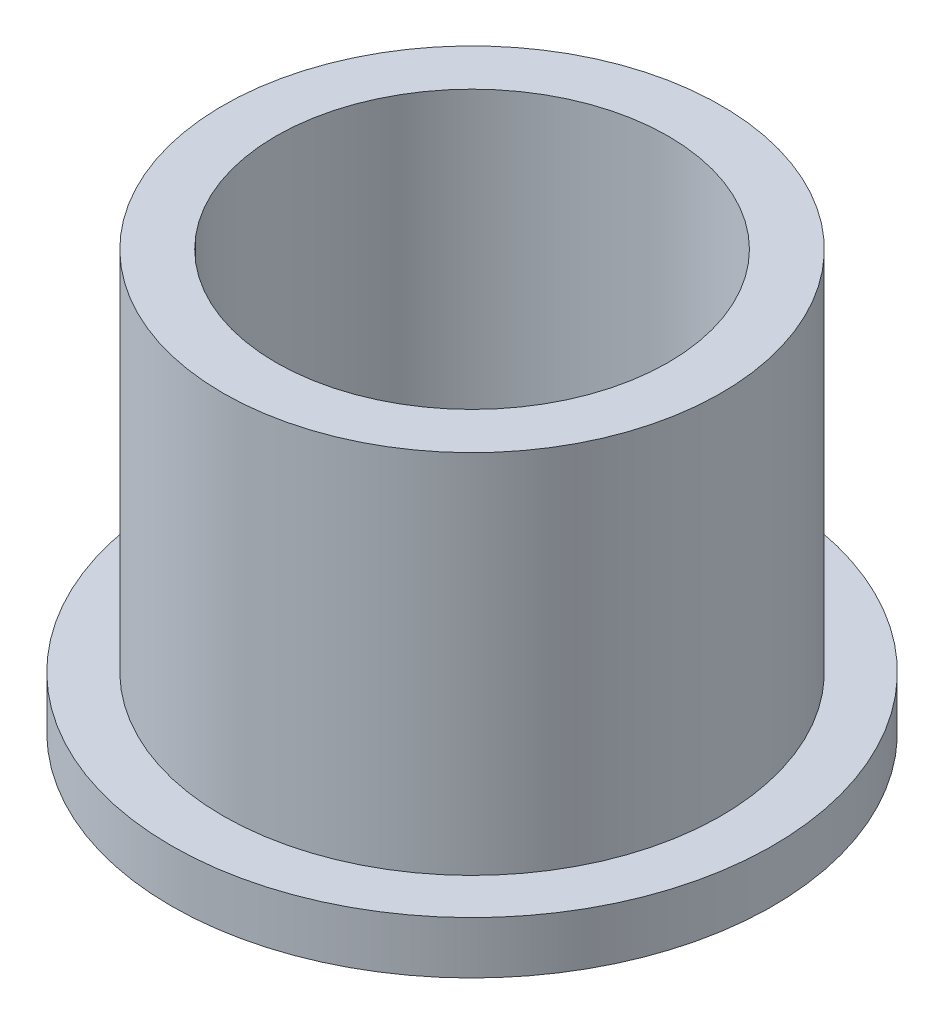
ISO-10303-21;
HEADER;
FILE_DESCRIPTION(('STEP AP214'),'2;1');
FILE_NAME('part.step','',(''),(''),'','','');
FILE_SCHEMA(('AUTOMOTIVE_DESIGN { 1 0 10303 214 1 1 1 1 }'));
ENDSEC;
DATA;
#1=APPLICATION_CONTEXT('core data for automotive mechanical design processes');
#2=APPLICATION_PROTOCOL_DEFINITION('international standard','automotive_design',2000,#1);
#3=PRODUCT_CONTEXT('',#1,'mechanical');
#4=PRODUCT('Part','Part','',(#3));
#5=PRODUCT_RELATED_PRODUCT_CATEGORY('part','',(#4));
#6=PRODUCT_DEFINITION_FORMATION('','',#4);
#7=PRODUCT_DEFINITION_CONTEXT('part definition',#1,'design');
#8=PRODUCT_DEFINITION('design','',#6,#7);
#9=PRODUCT_DEFINITION_SHAPE('','',#8);
#10=(LENGTH_UNIT() NAMED_UNIT(*) SI_UNIT(.MILLI.,.METRE.));
#11=(NAMED_UNIT(*) PLANE_ANGLE_UNIT() SI_UNIT($,.RADIAN.));
#12=(NAMED_UNIT(*) SI_UNIT($,.STERADIAN.) SOLID_ANGLE_UNIT());
#13=UNCERTAINTY_MEASURE_WITH_UNIT(LENGTH_MEASURE(1.E-05),#10,'distance_accuracy_value','');
#14=(GEOMETRIC_REPRESENTATION_CONTEXT(3) GLOBAL_UNCERTAINTY_ASSIGNED_CONTEXT((#13)) GLOBAL_UNIT_ASSIGNED_CONTEXT((#10,
#11,#12)) REPRESENTATION_CONTEXT('',''));
#15=CARTESIAN_POINT('',(0.,0.,0.));
#16=DIRECTION('',(0.,0.,1.));
#17=DIRECTION('',(1.,0.,0.));
#18=AXIS2_PLACEMENT_3D('',#15,#16,#17);
#19=CARTESIAN_POINT('',(0.,2.,0.));
#20=DIRECTION('',(0.,1.,0.));
#21=DIRECTION('',(1.,0.,0.));
#22=AXIS2_PLACEMENT_3D('',#19,#20,#21);
#23=PLANE('',#22);
#24=CARTESIAN_POINT('',(0.,2.,0.));
#25=DIRECTION('',(0.,1.,0.));
#26=DIRECTION('',(0.,0.,1.));
#27=AXIS2_PLACEMENT_3D('',#24,#25,#26);
#28=CIRCLE('',#27,9.525);
#29=CARTESIAN_POINT('',(0.,2.,9.525));
#30=VERTEX_POINT('',#29);
#31=EDGE_CURVE('E71',#30,#30,#28,.T.);
#32=ORIENTED_EDGE('',*,*,#31,.F.);
#33=EDGE_LOOP('',(#32));
#34=FACE_BOUND('',#33,.T.);
#35=CARTESIAN_POINT('',(0.,2.,0.));
#36=DIRECTION('',(0.,1.,0.));
#37=DIRECTION('',(0.,0.,1.));
#38=AXIS2_PLACEMENT_3D('',#35,#36,#37);
#39=CIRCLE('',#38,11.5);
#40=CARTESIAN_POINT('',(0.,2.,11.5));
#41=VERTEX_POINT('',#40);
#42=EDGE_CURVE('E57',#41,#41,#39,.T.);
#43=ORIENTED_EDGE('',*,*,#42,.T.);
#44=EDGE_LOOP('',(#43));
#45=FACE_BOUND('',#44,.T.);
#46=ADVANCED_FACE('F16',(#34,#45),#23,.T.);
#47=CARTESIAN_POINT('',(0.,0.,0.));
#48=DIRECTION('',(0.,1.,0.));
#49=DIRECTION('',(1.,0.,0.));
#50=AXIS2_PLACEMENT_3D('',#47,#48,#49);
#51=PLANE('',#50);
#52=CARTESIAN_POINT('',(0.,0.,0.));
#53=DIRECTION('',(0.,1.,0.));
#54=DIRECTION('',(0.,0.,1.));
#55=AXIS2_PLACEMENT_3D('',#52,#53,#54);
#56=CIRCLE('',#55,7.5);
#57=CARTESIAN_POINT('',(0.,0.,7.5));
#58=VERTEX_POINT('',#57);
#59=EDGE_CURVE('E19',#58,#58,#56,.T.);
#60=ORIENTED_EDGE('',*,*,#59,.T.);
#61=EDGE_LOOP('',(#60));
#62=FACE_BOUND('',#61,.T.);
#63=CARTESIAN_POINT('',(0.,0.,0.));
#64=DIRECTION('',(0.,1.,0.));
#65=DIRECTION('',(0.,0.,1.));
#66=AXIS2_PLACEMENT_3D('',#63,#64,#65);
#67=CIRCLE('',#66,11.5);
#68=CARTESIAN_POINT('',(0.,0.,11.5));
#69=VERTEX_POINT('',#68);
#70=EDGE_CURVE('E56',#69,#69,#67,.T.);
#71=ORIENTED_EDGE('',*,*,#70,.F.);
#72=EDGE_LOOP('',(#71));
#73=FACE_BOUND('',#72,.T.);
#74=ADVANCED_FACE('F88',(#62,#73),#51,.F.);
#75=CARTESIAN_POINT('',(0.,16.,0.));
#76=DIRECTION('',(0.,1.,0.));
#77=DIRECTION('',(1.,0.,0.));
#78=AXIS2_PLACEMENT_3D('',#75,#76,#77);
#79=PLANE('',#78);
#80=CARTESIAN_POINT('',(0.,16.,0.));
#81=DIRECTION('',(0.,1.,0.));
#82=DIRECTION('',(0.,0.,1.));
#83=AXIS2_PLACEMENT_3D('',#80,#81,#82);
#84=CIRCLE('',#83,7.5);
#85=CARTESIAN_POINT('',(0.,16.,7.5));
#86=VERTEX_POINT('',#85);
#87=EDGE_CURVE('E63',#86,#86,#84,.T.);
#88=ORIENTED_EDGE('',*,*,#87,.F.);
#89=EDGE_LOOP('',(#88));
#90=FACE_BOUND('',#89,.T.);
#91=CARTESIAN_POINT('',(0.,16.,0.));
#92=DIRECTION('',(0.,1.,0.));
#93=DIRECTION('',(0.,0.,1.));
#94=AXIS2_PLACEMENT_3D('',#91,#92,#93);
#95=CIRCLE('',#94,9.525);
#96=CARTESIAN_POINT('',(0.,16.,9.525));
#97=VERTEX_POINT('',#96);
#98=EDGE_CURVE('E11',#97,#97,#95,.T.);
#99=ORIENTED_EDGE('',*,*,#98,.T.);
#100=EDGE_LOOP('',(#99));
#101=FACE_BOUND('',#100,.T.);
#102=ADVANCED_FACE('F127',(#90,#101),#79,.T.);
#103=CARTESIAN_POINT('',(0.,16.,0.));
#104=DIRECTION('',(0.,-1.,0.));
#105=DIRECTION('',(0.,0.,-1.));
#106=AXIS2_PLACEMENT_3D('',#103,#104,#105);
#107=CYLINDRICAL_SURFACE('',#106,9.525);
#108=ORIENTED_EDGE('',*,*,#31,.T.);
#109=DIRECTION('',(0.,1.,0.));
#110=VECTOR('',#109,1.);
#111=CARTESIAN_POINT('',(0.,16.,9.525));
#112=LINE('',#111,#110);
#113=EDGE_CURVE('E26',#30,#97,#112,.T.);
#114=ORIENTED_EDGE('',*,*,#113,.T.);
#115=ORIENTED_EDGE('',*,*,#98,.F.);
#116=ORIENTED_EDGE('',*,*,#113,.F.);
#117=EDGE_LOOP('',(#108,#114,#115,#116));
#118=FACE_BOUND('',#117,.T.);
#119=ADVANCED_FACE('F129',(#118),#107,.T.);
#120=CARTESIAN_POINT('',(0.,16.,0.));
#121=DIRECTION('',(0.,-1.,0.));
#122=DIRECTION('',(0.,0.,-1.));
#123=AXIS2_PLACEMENT_3D('',#120,#121,#122);
#124=CYLINDRICAL_SURFACE('',#123,7.5);
#125=ORIENTED_EDGE('',*,*,#87,.T.);
#126=DIRECTION('',(0.,-1.,0.));
#127=VECTOR('',#126,1.);
#128=CARTESIAN_POINT('',(0.,16.,7.5));
#129=LINE('',#128,#127);
#130=EDGE_CURVE('E70',#86,#58,#129,.T.);
#131=ORIENTED_EDGE('',*,*,#130,.T.);
#132=ORIENTED_EDGE('',*,*,#59,.F.);
#133=ORIENTED_EDGE('',*,*,#130,.F.);
#134=EDGE_LOOP('',(#125,#131,#132,#133));
#135=FACE_BOUND('',#134,.T.);
#136=ADVANCED_FACE('F91',(#135),#124,.F.);
#137=CARTESIAN_POINT('',(0.,2.,0.));
#138=DIRECTION('',(0.,-1.,0.));
#139=DIRECTION('',(0.,0.,-1.));
#140=AXIS2_PLACEMENT_3D('',#137,#138,#139);
#141=CYLINDRICAL_SURFACE('',#140,11.5);
#142=ORIENTED_EDGE('',*,*,#70,.T.);
#143=DIRECTION('',(0.,1.,0.));
#144=VECTOR('',#143,1.);
#145=CARTESIAN_POINT('',(0.,2.,11.5));
#146=LINE('',#145,#144);
#147=EDGE_CURVE('E53',#69,#41,#146,.T.);
#148=ORIENTED_EDGE('',*,*,#147,.T.);
#149=ORIENTED_EDGE('',*,*,#42,.F.);
#150=ORIENTED_EDGE('',*,*,#147,.F.);
#151=EDGE_LOOP('',(#142,#148,#149,#150));
#152=FACE_BOUND('',#151,.T.);
#153=ADVANCED_FACE('F54',(#152),#141,.T.);
#154=CLOSED_SHELL('',(#46,#74,#102,#119,#136,#153));
#155=MANIFOLD_SOLID_BREP('B1',#154);
#156=ADVANCED_BREP_SHAPE_REPRESENTATION('',(#18,#155),#14);
#157=SHAPE_DEFINITION_REPRESENTATION(#9,#156);
ENDSEC;
END-ISO-10303-21;
